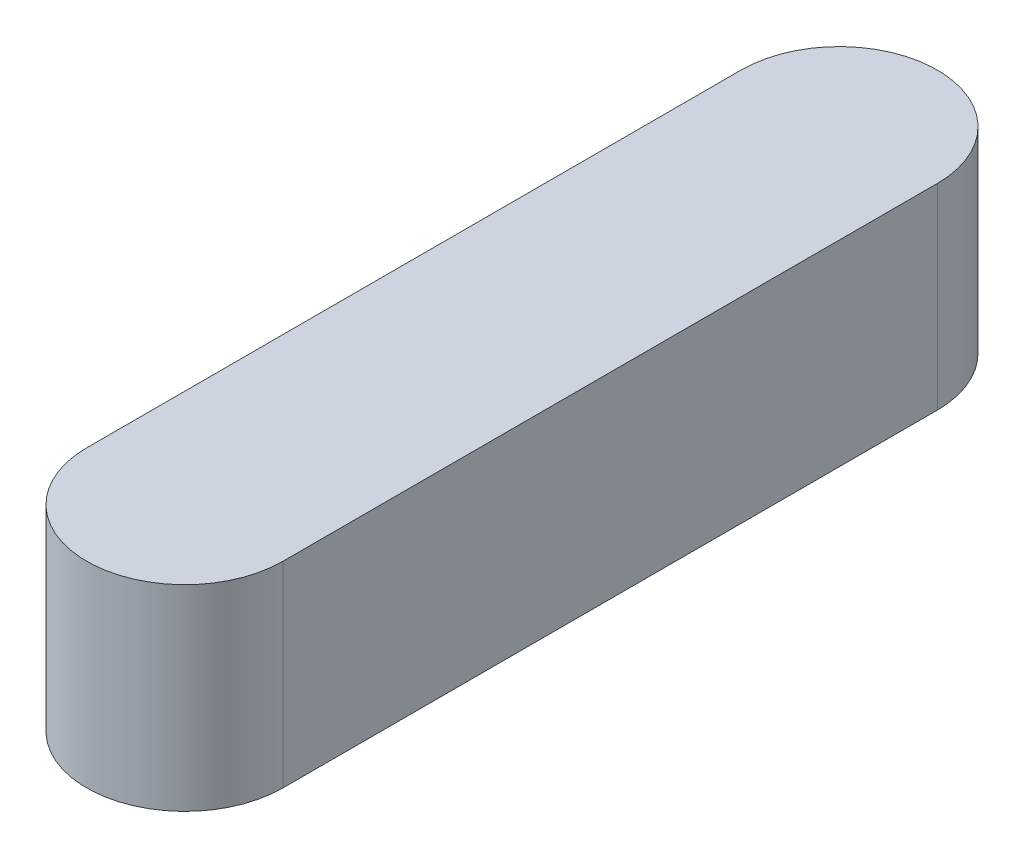
ISO-10303-21;
HEADER;
FILE_DESCRIPTION(('STEP AP214'),'2;1');
FILE_NAME('part.step','',(''),(''),'','','');
FILE_SCHEMA(('AUTOMOTIVE_DESIGN { 1 0 10303 214 1 1 1 1 }'));
ENDSEC;
DATA;
#1=APPLICATION_CONTEXT('core data for automotive mechanical design processes');
#2=APPLICATION_PROTOCOL_DEFINITION('international standard','automotive_design',2000,#1);
#3=PRODUCT_CONTEXT('',#1,'mechanical');
#4=PRODUCT('Part','Part','',(#3));
#5=PRODUCT_RELATED_PRODUCT_CATEGORY('part','',(#4));
#6=PRODUCT_DEFINITION_FORMATION('','',#4);
#7=PRODUCT_DEFINITION_CONTEXT('part definition',#1,'design');
#8=PRODUCT_DEFINITION('design','',#6,#7);
#9=PRODUCT_DEFINITION_SHAPE('','',#8);
#10=(LENGTH_UNIT() NAMED_UNIT(*) SI_UNIT(.MILLI.,.METRE.));
#11=(NAMED_UNIT(*) PLANE_ANGLE_UNIT() SI_UNIT($,.RADIAN.));
#12=(NAMED_UNIT(*) SI_UNIT($,.STERADIAN.) SOLID_ANGLE_UNIT());
#13=UNCERTAINTY_MEASURE_WITH_UNIT(LENGTH_MEASURE(1.E-05),#10,'distance_accuracy_value','');
#14=(GEOMETRIC_REPRESENTATION_CONTEXT(3) GLOBAL_UNCERTAINTY_ASSIGNED_CONTEXT((#13)) GLOBAL_UNIT_ASSIGNED_CONTEXT((#10,
#11,#12)) REPRESENTATION_CONTEXT('',''));
#15=CARTESIAN_POINT('',(0.,0.,0.));
#16=DIRECTION('',(0.,0.,1.));
#17=DIRECTION('',(1.,0.,0.));
#18=AXIS2_PLACEMENT_3D('',#15,#16,#17);
#19=CARTESIAN_POINT('',(0.,3.,-10.));
#20=DIRECTION('',(0.,-1.,0.));
#21=DIRECTION('',(0.,0.,-1.));
#22=AXIS2_PLACEMENT_3D('',#19,#20,#21);
#23=CYLINDRICAL_SURFACE('',#22,3.);
#24=CARTESIAN_POINT('',(0.,-3.,-10.));
#25=DIRECTION('',(0.,1.,0.));
#26=DIRECTION('',(0.,0.,1.));
#27=AXIS2_PLACEMENT_3D('',#24,#25,#26);
#28=CIRCLE('',#27,3.);
#29=CARTESIAN_POINT('',(3.,-3.,-10.));
#30=VERTEX_POINT('',#29);
#31=CARTESIAN_POINT('',(-3.,-3.,-10.));
#32=VERTEX_POINT('',#31);
#33=EDGE_CURVE('E97',#30,#32,#28,.T.);
#34=ORIENTED_EDGE('',*,*,#33,.T.);
#35=DIRECTION('',(0.,-1.,0.));
#36=VECTOR('',#35,1.);
#37=CARTESIAN_POINT('',(-3.,3.,-10.));
#38=LINE('',#37,#36);
#39=CARTESIAN_POINT('',(-3.,3.,-10.));
#40=VERTEX_POINT('',#39);
#41=EDGE_CURVE('E11',#40,#32,#38,.T.);
#42=ORIENTED_EDGE('',*,*,#41,.F.);
#43=CARTESIAN_POINT('',(0.,3.,-10.));
#44=DIRECTION('',(0.,1.,0.));
#45=DIRECTION('',(0.,0.,1.));
#46=AXIS2_PLACEMENT_3D('',#43,#44,#45);
#47=CIRCLE('',#46,3.);
#48=CARTESIAN_POINT('',(3.,3.,-10.));
#49=VERTEX_POINT('',#48);
#50=EDGE_CURVE('E85',#49,#40,#47,.T.);
#51=ORIENTED_EDGE('',*,*,#50,.F.);
#52=DIRECTION('',(0.,-1.,0.));
#53=VECTOR('',#52,1.);
#54=CARTESIAN_POINT('',(3.,3.,-10.));
#55=LINE('',#54,#53);
#56=EDGE_CURVE('E93',#49,#30,#55,.T.);
#57=ORIENTED_EDGE('',*,*,#56,.T.);
#58=EDGE_LOOP('',(#34,#42,#51,#57));
#59=FACE_BOUND('',#58,.T.);
#60=ADVANCED_FACE('F34',(#59),#23,.T.);
#61=CARTESIAN_POINT('',(-3.,3.,-10.));
#62=DIRECTION('',(1.,0.,0.));
#63=DIRECTION('',(0.,0.,-1.));
#64=AXIS2_PLACEMENT_3D('',#61,#62,#63);
#65=PLANE('',#64);
#66=DIRECTION('',(0.,0.,1.));
#67=VECTOR('',#66,1.);
#68=CARTESIAN_POINT('',(-3.,-3.,-10.));
#69=LINE('',#68,#67);
#70=CARTESIAN_POINT('',(-3.,-3.,10.));
#71=VERTEX_POINT('',#70);
#72=EDGE_CURVE('E89',#32,#71,#69,.T.);
#73=ORIENTED_EDGE('',*,*,#72,.T.);
#74=DIRECTION('',(0.,-1.,0.));
#75=VECTOR('',#74,1.);
#76=CARTESIAN_POINT('',(-3.,3.,10.));
#77=LINE('',#76,#75);
#78=CARTESIAN_POINT('',(-3.,3.,10.));
#79=VERTEX_POINT('',#78);
#80=EDGE_CURVE('E42',#79,#71,#77,.T.);
#81=ORIENTED_EDGE('',*,*,#80,.F.);
#82=DIRECTION('',(0.,0.,1.));
#83=VECTOR('',#82,1.);
#84=CARTESIAN_POINT('',(-3.,3.,-10.));
#85=LINE('',#84,#83);
#86=EDGE_CURVE('E80',#40,#79,#85,.T.);
#87=ORIENTED_EDGE('',*,*,#86,.F.);
#88=ORIENTED_EDGE('',*,*,#41,.T.);
#89=EDGE_LOOP('',(#73,#81,#87,#88));
#90=FACE_BOUND('',#89,.T.);
#91=ADVANCED_FACE('F88',(#90),#65,.F.);
#92=CARTESIAN_POINT('',(0.,3.,10.));
#93=DIRECTION('',(0.,-1.,0.));
#94=DIRECTION('',(0.,0.,-1.));
#95=AXIS2_PLACEMENT_3D('',#92,#93,#94);
#96=CYLINDRICAL_SURFACE('',#95,3.);
#97=CARTESIAN_POINT('',(0.,-3.,10.));
#98=DIRECTION('',(0.,1.,0.));
#99=DIRECTION('',(0.,0.,1.));
#100=AXIS2_PLACEMENT_3D('',#97,#98,#99);
#101=CIRCLE('',#100,3.);
#102=CARTESIAN_POINT('',(3.,-3.,10.));
#103=VERTEX_POINT('',#102);
#104=EDGE_CURVE('E67',#71,#103,#101,.T.);
#105=ORIENTED_EDGE('',*,*,#104,.T.);
#106=DIRECTION('',(0.,-1.,0.));
#107=VECTOR('',#106,1.);
#108=CARTESIAN_POINT('',(3.,3.,10.));
#109=LINE('',#108,#107);
#110=CARTESIAN_POINT('',(3.,3.,10.));
#111=VERTEX_POINT('',#110);
#112=EDGE_CURVE('E90',#111,#103,#109,.T.);
#113=ORIENTED_EDGE('',*,*,#112,.F.);
#114=CARTESIAN_POINT('',(0.,3.,10.));
#115=DIRECTION('',(0.,1.,0.));
#116=DIRECTION('',(0.,0.,1.));
#117=AXIS2_PLACEMENT_3D('',#114,#115,#116);
#118=CIRCLE('',#117,3.);
#119=EDGE_CURVE('E83',#79,#111,#118,.T.);
#120=ORIENTED_EDGE('',*,*,#119,.F.);
#121=ORIENTED_EDGE('',*,*,#80,.T.);
#122=EDGE_LOOP('',(#105,#113,#120,#121));
#123=FACE_BOUND('',#122,.T.);
#124=ADVANCED_FACE('F91',(#123),#96,.T.);
#125=CARTESIAN_POINT('',(3.,3.,-10.));
#126=DIRECTION('',(-1.,0.,0.));
#127=DIRECTION('',(0.,0.,1.));
#128=AXIS2_PLACEMENT_3D('',#125,#126,#127);
#129=PLANE('',#128);
#130=DIRECTION('',(0.,0.,-1.));
#131=VECTOR('',#130,1.);
#132=CARTESIAN_POINT('',(3.,-3.,-10.));
#133=LINE('',#132,#131);
#134=EDGE_CURVE('E73',#103,#30,#133,.T.);
#135=ORIENTED_EDGE('',*,*,#134,.T.);
#136=ORIENTED_EDGE('',*,*,#56,.F.);
#137=DIRECTION('',(0.,0.,-1.));
#138=VECTOR('',#137,1.);
#139=CARTESIAN_POINT('',(3.,3.,-10.));
#140=LINE('',#139,#138);
#141=EDGE_CURVE('E50',#111,#49,#140,.T.);
#142=ORIENTED_EDGE('',*,*,#141,.F.);
#143=ORIENTED_EDGE('',*,*,#112,.T.);
#144=EDGE_LOOP('',(#135,#136,#142,#143));
#145=FACE_BOUND('',#144,.T.);
#146=ADVANCED_FACE('F104',(#145),#129,.F.);
#147=CARTESIAN_POINT('',(0.,3.,-10.));
#148=DIRECTION('',(0.,1.,0.));
#149=DIRECTION('',(0.,0.,1.));
#150=AXIS2_PLACEMENT_3D('',#147,#148,#149);
#151=PLANE('',#150);
#152=ORIENTED_EDGE('',*,*,#50,.T.);
#153=ORIENTED_EDGE('',*,*,#86,.T.);
#154=ORIENTED_EDGE('',*,*,#119,.T.);
#155=ORIENTED_EDGE('',*,*,#141,.T.);
#156=EDGE_LOOP('',(#152,#153,#154,#155));
#157=FACE_BOUND('',#156,.T.);
#158=ADVANCED_FACE('F81',(#157),#151,.T.);
#159=CARTESIAN_POINT('',(0.,-3.,-10.));
#160=DIRECTION('',(0.,1.,0.));
#161=DIRECTION('',(0.,0.,1.));
#162=AXIS2_PLACEMENT_3D('',#159,#160,#161);
#163=PLANE('',#162);
#164=ORIENTED_EDGE('',*,*,#33,.F.);
#165=ORIENTED_EDGE('',*,*,#134,.F.);
#166=ORIENTED_EDGE('',*,*,#104,.F.);
#167=ORIENTED_EDGE('',*,*,#72,.F.);
#168=EDGE_LOOP('',(#164,#165,#166,#167));
#169=FACE_BOUND('',#168,.T.);
#170=ADVANCED_FACE('F107',(#169),#163,.F.);
#171=CLOSED_SHELL('',(#60,#91,#124,#146,#158,#170));
#172=MANIFOLD_SOLID_BREP('B2',#171);
#173=ADVANCED_BREP_SHAPE_REPRESENTATION('',(#18,#172),#14);
#174=SHAPE_DEFINITION_REPRESENTATION(#9,#173);
ENDSEC;
END-ISO-10303-21;
